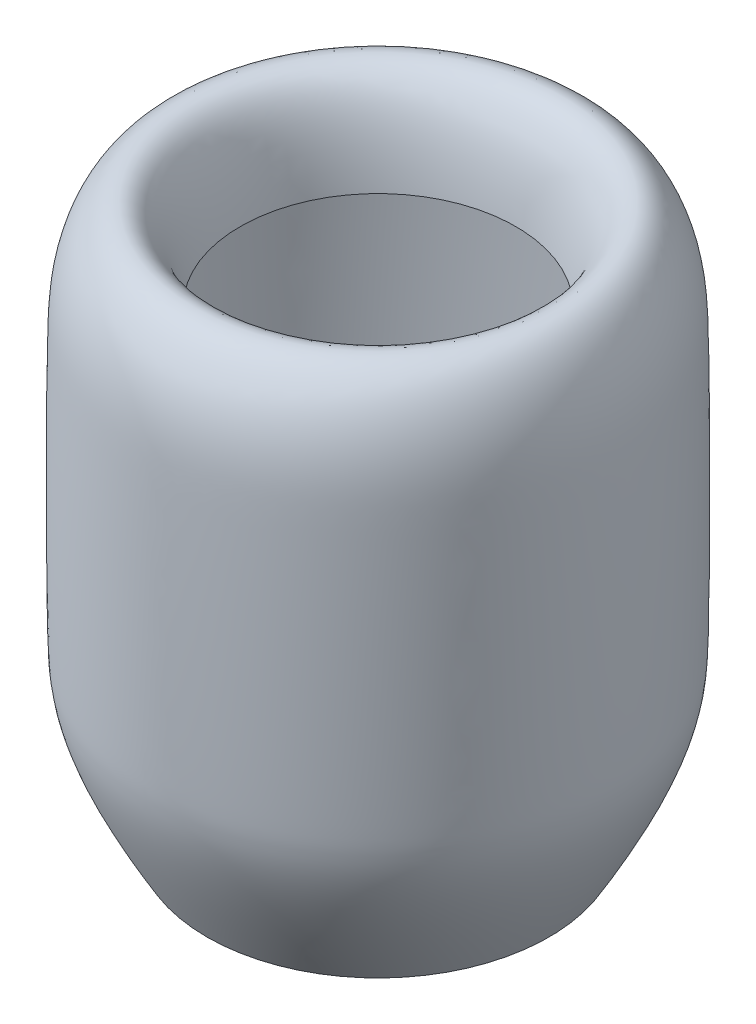
ISO-10303-21;
HEADER;
FILE_DESCRIPTION(('STEP AP214'),'2;1');
FILE_NAME('part.step','',(''),(''),'','','');
FILE_SCHEMA(('AUTOMOTIVE_DESIGN { 1 0 10303 214 1 1 1 1 }'));
ENDSEC;
DATA;
#1=APPLICATION_CONTEXT('core data for automotive mechanical design processes');
#2=APPLICATION_PROTOCOL_DEFINITION('international standard','automotive_design',2000,#1);
#3=PRODUCT_CONTEXT('',#1,'mechanical');
#4=PRODUCT('Part','Part','',(#3));
#5=PRODUCT_RELATED_PRODUCT_CATEGORY('part','',(#4));
#6=PRODUCT_DEFINITION_FORMATION('','',#4);
#7=PRODUCT_DEFINITION_CONTEXT('part definition',#1,'design');
#8=PRODUCT_DEFINITION('design','',#6,#7);
#9=PRODUCT_DEFINITION_SHAPE('','',#8);
#10=(LENGTH_UNIT() NAMED_UNIT(*) SI_UNIT(.MILLI.,.METRE.));
#11=(NAMED_UNIT(*) PLANE_ANGLE_UNIT() SI_UNIT($,.RADIAN.));
#12=(NAMED_UNIT(*) SI_UNIT($,.STERADIAN.) SOLID_ANGLE_UNIT());
#13=UNCERTAINTY_MEASURE_WITH_UNIT(LENGTH_MEASURE(1.E-05),#10,'distance_accuracy_value','');
#14=(GEOMETRIC_REPRESENTATION_CONTEXT(3) GLOBAL_UNCERTAINTY_ASSIGNED_CONTEXT((#13)) GLOBAL_UNIT_ASSIGNED_CONTEXT((#10,
#11,#12)) REPRESENTATION_CONTEXT('',''));
#15=CARTESIAN_POINT('',(0.,0.,0.));
#16=DIRECTION('',(0.,0.,1.));
#17=DIRECTION('',(1.,0.,0.));
#18=AXIS2_PLACEMENT_3D('',#15,#16,#17);
#19=CARTESIAN_POINT('',(46.,0.,0.));
#20=CARTESIAN_POINT('',(50.9933971001775,43.4224413494784,0.));
#21=CARTESIAN_POINT('',(74.4192310372411,29.0667025173688,0.));
#22=CARTESIAN_POINT('',(75.887608064845,-30.1706648424878,0.));
#23=CARTESIAN_POINT('',(75.613452988558,-93.0299903677548,0.));
#24=CARTESIAN_POINT('',(74.5221700971514,-105.89674932675,0.));
#25=CARTESIAN_POINT('',(71.8537440984771,-121.07553247764,0.));
#26=CARTESIAN_POINT('',(54.9999999999995,-150.000000000001,0.));
#27=B_SPLINE_CURVE_WITH_KNOTS('',3,(#19,#20,#21,#22,#23,#24,#25,#26),.UNSPECIFIED.,.F.,.F.,(4,1,
1,1,1,4),(0.,0.332423256181795,0.386421074120653,0.677937348688572,0.742939194708605,1.),.UNSPECIFIED.);
#28=CARTESIAN_POINT('',(0.,0.,0.));
#29=DIRECTION('',(0.,1.,0.));
#30=AXIS1_PLACEMENT('',#28,#29);
#31=SURFACE_OF_REVOLUTION('',#27,#30);
#32=CARTESIAN_POINT('',(0.,-150.,0.));
#33=DIRECTION('',(0.,1.,0.));
#34=DIRECTION('',(0.,0.,1.));
#35=AXIS2_PLACEMENT_3D('',#32,#33,#34);
#36=CIRCLE('',#35,55.);
#37=CARTESIAN_POINT('',(0.,-150.,55.));
#38=VERTEX_POINT('',#37);
#39=EDGE_CURVE('E10',#38,#38,#36,.T.);
#40=ORIENTED_EDGE('',*,*,#39,.F.);
#41=EDGE_LOOP('',(#40));
#42=FACE_BOUND('',#41,.T.);
#43=CARTESIAN_POINT('',(0.,0.,0.));
#44=DIRECTION('',(0.,1.,0.));
#45=DIRECTION('',(0.,0.,1.));
#46=AXIS2_PLACEMENT_3D('',#43,#44,#45);
#47=CIRCLE('',#46,46.);
#48=CARTESIAN_POINT('',(0.,0.,46.));
#49=VERTEX_POINT('',#48);
#50=EDGE_CURVE('E48',#49,#49,#47,.T.);
#51=ORIENTED_EDGE('',*,*,#50,.T.);
#52=EDGE_LOOP('',(#51));
#53=FACE_BOUND('',#52,.T.);
#54=ADVANCED_FACE('F33',(#42,#53),#31,.T.);
#55=CARTESIAN_POINT('',(0.,-150.,0.));
#56=DIRECTION('',(0.,-1.,0.));
#57=DIRECTION('',(0.,0.,-1.));
#58=AXIS2_PLACEMENT_3D('',#55,#56,#57);
#59=CONICAL_SURFACE('',#58,55.,1.04320856541476);
#60=CARTESIAN_POINT('',(0.,-150.503450575864,0.));
#61=DIRECTION('',(0.,1.,0.));
#62=DIRECTION('',(0.,0.,1.));
#63=AXIS2_PLACEMENT_3D('',#60,#61,#62);
#64=CIRCLE('',#63,55.8640240260907);
#65=CARTESIAN_POINT('',(0.,-150.503450575864,55.8640240260907));
#66=VERTEX_POINT('',#65);
#67=EDGE_CURVE('E40',#66,#66,#64,.T.);
#68=ORIENTED_EDGE('',*,*,#67,.F.);
#69=EDGE_LOOP('',(#68));
#70=FACE_BOUND('',#69,.T.);
#71=ORIENTED_EDGE('',*,*,#39,.T.);
#72=EDGE_LOOP('',(#71));
#73=FACE_BOUND('',#72,.T.);
#74=ADVANCED_FACE('F67',(#70,#73),#59,.F.);
#75=CARTESIAN_POINT('',(55.8640240260907,-150.503450575864,0.));
#76=CARTESIAN_POINT('',(56.3674413967225,-149.639483536733,0.));
#77=CARTESIAN_POINT('',(57.3820729234915,-147.882500868379,0.));
#78=CARTESIAN_POINT('',(58.7966717420311,-145.386184344614,0.));
#79=CARTESIAN_POINT('',(60.1417972920296,-142.965951037677,0.));
#80=CARTESIAN_POINT('',(61.8330223049933,-139.859537439724,0.));
#81=CARTESIAN_POINT('',(63.7667458991814,-136.187722813188,0.));
#82=CARTESIAN_POINT('',(65.8149115108722,-132.107058319537,0.));
#83=CARTESIAN_POINT('',(67.6092640938333,-128.335514056452,0.));
#84=CARTESIAN_POINT('',(69.6871118841151,-123.698544356344,0.));
#85=CARTESIAN_POINT('',(71.7394629300752,-118.597826519355,0.));
#86=CARTESIAN_POINT('',(73.4735797637513,-113.466672248027,0.));
#87=CARTESIAN_POINT('',(74.6212970464148,-109.202041189307,0.));
#88=CARTESIAN_POINT('',(75.3257047501165,-105.691817603041,0.));
#89=CARTESIAN_POINT('',(75.7263895832879,-102.804562872018,0.));
#90=CARTESIAN_POINT('',(75.9803328683045,-100.516841802857,0.));
#91=CARTESIAN_POINT('',(76.1269913562216,-98.2132227866145,0.));
#92=CARTESIAN_POINT('',(76.2259514931766,-95.4746912257643,0.));
#93=CARTESIAN_POINT('',(76.3193410672417,-92.0172555258465,0.));
#94=CARTESIAN_POINT('',(76.4227503577199,-86.5039672084225,0.));
#95=CARTESIAN_POINT('',(76.5232615267945,-78.3121714102114,0.));
#96=CARTESIAN_POINT('',(76.6213248755253,-65.7622660470165,0.));
#97=CARTESIAN_POINT('',(76.659503219375,-51.4725999034286,0.));
#98=CARTESIAN_POINT('',(76.6240782171612,-36.8501212226987,0.));
#99=CARTESIAN_POINT('',(76.5596769019441,-26.0722694802569,0.));
#100=CARTESIAN_POINT('',(76.4454669070154,-15.8213064397733,0.));
#101=CARTESIAN_POINT('',(76.3111338938598,-6.50133901320443,0.));
#102=CARTESIAN_POINT('',(76.0065280546275,1.781881660534,0.));
#103=CARTESIAN_POINT('',(74.9082238266084,9.35443692093519,0.));
#104=CARTESIAN_POINT('',(72.9686708265153,16.0495087251773,0.));
#105=CARTESIAN_POINT('',(70.3840494909512,21.6591983005094,0.));
#106=CARTESIAN_POINT('',(67.2723103250638,25.9931854790252,0.));
#107=CARTESIAN_POINT('',(63.7354110127862,28.8559644256983,0.));
#108=CARTESIAN_POINT('',(59.775616351803,29.9447030911879,0.));
#109=CARTESIAN_POINT('',(55.7624382140691,28.7524001477026,0.));
#110=CARTESIAN_POINT('',(52.8225312756635,25.8907371048809,0.));
#111=CARTESIAN_POINT('',(50.7142617401397,22.4792021350868,0.));
#112=CARTESIAN_POINT('',(49.2607988775367,19.3273991966434,0.));
#113=CARTESIAN_POINT('',(47.9448914543985,15.556110412051,0.));
#114=CARTESIAN_POINT('',(46.9745867938303,11.8728444195555,0.));
#115=CARTESIAN_POINT('',(46.2821758023938,8.58727768742949,0.));
#116=CARTESIAN_POINT('',(45.8071090757114,5.95130273945141,0.));
#117=CARTESIAN_POINT('',(45.4494762225831,3.60453447361284,0.));
#118=CARTESIAN_POINT('',(45.1885177498488,1.64446051928665,0.));
#119=CARTESIAN_POINT('',(45.0648275699621,0.62104777640401,0.));
#120=CARTESIAN_POINT('',(45.0065471499391,0.114242875952816,0.));
#121=B_SPLINE_CURVE_WITH_KNOTS('',3,(#75,#76,#77,#78,#79,#80,#81,#82,#83,#84,#85,#86,#87,#88,
#89,#90,#91,#92,#93,#94,#95,#96,#97,#98,#99,#100,#101,#102,#103,#104,#105,#106,#107,#108,#109,
#110,#111,#112,#113,#114,#115,#116,#117,#118,#119,#120),.UNSPECIFIED.,.F.,.F.,(4,1,1,1,1,1,1,1,
1,1,1,1,1,1,1,1,1,1,1,1,1,1,1,1,1,1,1,1,1,1,1,1,1,1,1,1,1,1,1,1,1,1,1,4),(0.,0.0078125,0.015625,
0.0234375,0.03125,0.046875,0.0625,0.078125,0.09375,0.125,0.15625,0.1875,0.21875,0.25,0.28125,
0.3125,0.328125,0.34375,0.375,0.40625,0.4375,0.5,0.53125,0.5625,0.59375,0.625,0.65625,0.6875,
0.71875,0.75,0.78125,0.8125,0.84375,0.875,0.90625,0.921875,0.9375,0.953125,0.96875,0.9765625,
0.984375,0.9921875,0.99609375,1.),.UNSPECIFIED.);
#122=CARTESIAN_POINT('',(0.,0.,0.));
#123=DIRECTION('',(0.,1.,0.));
#124=AXIS1_PLACEMENT('',#122,#123);
#125=SURFACE_OF_REVOLUTION('',#121,#124);
#126=CARTESIAN_POINT('',(0.,0.114242875952816,0.));
#127=DIRECTION('',(0.,1.,0.));
#128=DIRECTION('',(0.,0.,1.));
#129=AXIS2_PLACEMENT_3D('',#126,#127,#128);
#130=CIRCLE('',#129,45.0065471499391);
#131=CARTESIAN_POINT('',(0.,0.114242875952816,45.0065471499391));
#132=VERTEX_POINT('',#131);
#133=EDGE_CURVE('E44',#132,#132,#130,.T.);
#134=ORIENTED_EDGE('',*,*,#133,.F.);
#135=EDGE_LOOP('',(#134));
#136=FACE_BOUND('',#135,.T.);
#137=ORIENTED_EDGE('',*,*,#67,.T.);
#138=EDGE_LOOP('',(#137));
#139=FACE_BOUND('',#138,.T.);
#140=ADVANCED_FACE('F63',(#136,#139),#125,.T.);
#141=CARTESIAN_POINT('',(0.,0.114242875952816,0.));
#142=DIRECTION('',(0.,-1.,0.));
#143=DIRECTION('',(0.,0.,-1.));
#144=AXIS2_PLACEMENT_3D('',#141,#142,#143);
#145=CONICAL_SURFACE('',#144,45.0065471499391,1.45630347431978);
#146=ORIENTED_EDGE('',*,*,#50,.F.);
#147=EDGE_LOOP('',(#146));
#148=FACE_BOUND('',#147,.T.);
#149=ORIENTED_EDGE('',*,*,#133,.T.);
#150=EDGE_LOOP('',(#149));
#151=FACE_BOUND('',#150,.T.);
#152=ADVANCED_FACE('F66',(#148,#151),#145,.F.);
#153=CLOSED_SHELL('',(#54,#74,#140,#152));
#154=MANIFOLD_SOLID_BREP('B2',#153);
#155=ADVANCED_BREP_SHAPE_REPRESENTATION('',(#18,#154),#14);
#156=SHAPE_DEFINITION_REPRESENTATION(#9,#155);
ENDSEC;
END-ISO-10303-21;
